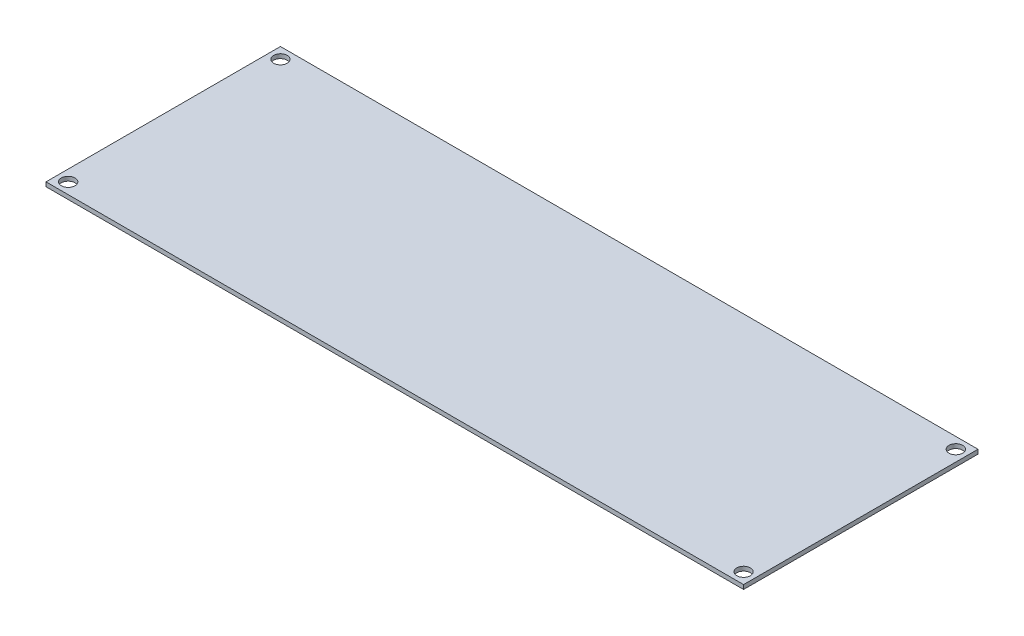
ISO-10303-21;
HEADER;
FILE_DESCRIPTION(('STEP AP214'),'2;1');
FILE_NAME('part.step','',(''),(''),'','','');
FILE_SCHEMA(('AUTOMOTIVE_DESIGN { 1 0 10303 214 1 1 1 1 }'));
ENDSEC;
DATA;
#1=APPLICATION_CONTEXT('core data for automotive mechanical design processes');
#2=APPLICATION_PROTOCOL_DEFINITION('international standard','automotive_design',2000,#1);
#3=PRODUCT_CONTEXT('',#1,'mechanical');
#4=PRODUCT('Part','Part','',(#3));
#5=PRODUCT_RELATED_PRODUCT_CATEGORY('part','',(#4));
#6=PRODUCT_DEFINITION_FORMATION('','',#4);
#7=PRODUCT_DEFINITION_CONTEXT('part definition',#1,'design');
#8=PRODUCT_DEFINITION('design','',#6,#7);
#9=PRODUCT_DEFINITION_SHAPE('','',#8);
#10=(LENGTH_UNIT() NAMED_UNIT(*) SI_UNIT(.MILLI.,.METRE.));
#11=(NAMED_UNIT(*) PLANE_ANGLE_UNIT() SI_UNIT($,.RADIAN.));
#12=(NAMED_UNIT(*) SI_UNIT($,.STERADIAN.) SOLID_ANGLE_UNIT());
#13=UNCERTAINTY_MEASURE_WITH_UNIT(LENGTH_MEASURE(1.E-05),#10,'distance_accuracy_value','');
#14=(GEOMETRIC_REPRESENTATION_CONTEXT(3) GLOBAL_UNCERTAINTY_ASSIGNED_CONTEXT((#13)) GLOBAL_UNIT_ASSIGNED_CONTEXT((#10,
#11,#12)) REPRESENTATION_CONTEXT('',''));
#15=CARTESIAN_POINT('',(0.,0.,0.));
#16=DIRECTION('',(0.,0.,1.));
#17=DIRECTION('',(1.,0.,0.));
#18=AXIS2_PLACEMENT_3D('',#15,#16,#17);
#19=CARTESIAN_POINT('',(0.,1.,0.));
#20=DIRECTION('',(0.,-1.,0.));
#21=DIRECTION('',(0.,0.,-1.));
#22=AXIS2_PLACEMENT_3D('',#19,#20,#21);
#23=PLANE('',#22);
#24=CARTESIAN_POINT('',(-79.23,1.,-24.9));
#25=DIRECTION('',(0.,1.,0.));
#26=DIRECTION('',(0.,0.,1.));
#27=AXIS2_PLACEMENT_3D('',#24,#25,#26);
#28=CIRCLE('',#27,1.6);
#29=CARTESIAN_POINT('',(-79.23,1.,-23.3));
#30=VERTEX_POINT('',#29);
#31=EDGE_CURVE('E120',#30,#30,#28,.T.);
#32=ORIENTED_EDGE('',*,*,#31,.F.);
#33=EDGE_LOOP('',(#32));
#34=FACE_BOUND('',#33,.T.);
#35=CARTESIAN_POINT('',(79.23,1.,-24.9));
#36=DIRECTION('',(0.,1.,0.));
#37=DIRECTION('',(0.,0.,1.));
#38=AXIS2_PLACEMENT_3D('',#35,#36,#37);
#39=CIRCLE('',#38,1.6);
#40=CARTESIAN_POINT('',(79.23,1.,-23.3));
#41=VERTEX_POINT('',#40);
#42=EDGE_CURVE('E99',#41,#41,#39,.T.);
#43=ORIENTED_EDGE('',*,*,#42,.F.);
#44=EDGE_LOOP('',(#43));
#45=FACE_BOUND('',#44,.T.);
#46=DIRECTION('',(0.,0.,-1.));
#47=VECTOR('',#46,1.);
#48=CARTESIAN_POINT('',(81.83,1.,27.5));
#49=LINE('',#48,#47);
#50=CARTESIAN_POINT('',(81.83,1.,27.5));
#51=VERTEX_POINT('',#50);
#52=CARTESIAN_POINT('',(81.83,1.,-27.5));
#53=VERTEX_POINT('',#52);
#54=EDGE_CURVE('E84',#51,#53,#49,.T.);
#55=ORIENTED_EDGE('',*,*,#54,.T.);
#56=DIRECTION('',(-1.,0.,0.));
#57=VECTOR('',#56,1.);
#58=CARTESIAN_POINT('',(-81.83,1.,-27.5));
#59=LINE('',#58,#57);
#60=CARTESIAN_POINT('',(-81.83,1.,-27.5));
#61=VERTEX_POINT('',#60);
#62=EDGE_CURVE('E79',#53,#61,#59,.T.);
#63=ORIENTED_EDGE('',*,*,#62,.T.);
#64=DIRECTION('',(0.,0.,1.));
#65=VECTOR('',#64,1.);
#66=CARTESIAN_POINT('',(-81.83,1.,27.5));
#67=LINE('',#66,#65);
#68=CARTESIAN_POINT('',(-81.83,1.,27.5));
#69=VERTEX_POINT('',#68);
#70=EDGE_CURVE('E82',#61,#69,#67,.T.);
#71=ORIENTED_EDGE('',*,*,#70,.T.);
#72=DIRECTION('',(1.,0.,0.));
#73=VECTOR('',#72,1.);
#74=CARTESIAN_POINT('',(-81.83,1.,27.5));
#75=LINE('',#74,#73);
#76=EDGE_CURVE('E49',#69,#51,#75,.T.);
#77=ORIENTED_EDGE('',*,*,#76,.T.);
#78=EDGE_LOOP('',(#55,#63,#71,#77));
#79=FACE_BOUND('',#78,.T.);
#80=CARTESIAN_POINT('',(79.23,1.,24.9));
#81=DIRECTION('',(0.,1.,0.));
#82=DIRECTION('',(0.,0.,1.));
#83=AXIS2_PLACEMENT_3D('',#80,#81,#82);
#84=CIRCLE('',#83,1.6);
#85=CARTESIAN_POINT('',(79.23,1.,26.5));
#86=VERTEX_POINT('',#85);
#87=EDGE_CURVE('E114',#86,#86,#84,.T.);
#88=ORIENTED_EDGE('',*,*,#87,.F.);
#89=EDGE_LOOP('',(#88));
#90=FACE_BOUND('',#89,.T.);
#91=CARTESIAN_POINT('',(-79.23,1.,24.9));
#92=DIRECTION('',(0.,1.,0.));
#93=DIRECTION('',(0.,0.,1.));
#94=AXIS2_PLACEMENT_3D('',#91,#92,#93);
#95=CIRCLE('',#94,1.6);
#96=CARTESIAN_POINT('',(-79.23,1.,26.5));
#97=VERTEX_POINT('',#96);
#98=EDGE_CURVE('E126',#97,#97,#95,.T.);
#99=ORIENTED_EDGE('',*,*,#98,.F.);
#100=EDGE_LOOP('',(#99));
#101=FACE_BOUND('',#100,.T.);
#102=ADVANCED_FACE('F32',(#34,#45,#79,#90,#101),#23,.F.);
#103=CARTESIAN_POINT('',(0.,0.,0.));
#104=DIRECTION('',(0.,-1.,0.));
#105=DIRECTION('',(0.,0.,-1.));
#106=AXIS2_PLACEMENT_3D('',#103,#104,#105);
#107=PLANE('',#106);
#108=CARTESIAN_POINT('',(-79.23,0.,-24.9));
#109=DIRECTION('',(0.,1.,0.));
#110=DIRECTION('',(0.,0.,1.));
#111=AXIS2_PLACEMENT_3D('',#108,#109,#110);
#112=CIRCLE('',#111,1.6);
#113=CARTESIAN_POINT('',(-79.23,0.,-23.3));
#114=VERTEX_POINT('',#113);
#115=EDGE_CURVE('E123',#114,#114,#112,.T.);
#116=ORIENTED_EDGE('',*,*,#115,.T.);
#117=EDGE_LOOP('',(#116));
#118=FACE_BOUND('',#117,.T.);
#119=CARTESIAN_POINT('',(79.23,0.,-24.9));
#120=DIRECTION('',(0.,1.,0.));
#121=DIRECTION('',(0.,0.,1.));
#122=AXIS2_PLACEMENT_3D('',#119,#120,#121);
#123=CIRCLE('',#122,1.6);
#124=CARTESIAN_POINT('',(79.23,0.,-23.3));
#125=VERTEX_POINT('',#124);
#126=EDGE_CURVE('E111',#125,#125,#123,.T.);
#127=ORIENTED_EDGE('',*,*,#126,.T.);
#128=EDGE_LOOP('',(#127));
#129=FACE_BOUND('',#128,.T.);
#130=DIRECTION('',(0.,0.,-1.));
#131=VECTOR('',#130,1.);
#132=CARTESIAN_POINT('',(81.83,0.,27.5));
#133=LINE('',#132,#131);
#134=CARTESIAN_POINT('',(81.83,0.,27.5));
#135=VERTEX_POINT('',#134);
#136=CARTESIAN_POINT('',(81.83,0.,-27.5));
#137=VERTEX_POINT('',#136);
#138=EDGE_CURVE('E96',#135,#137,#133,.T.);
#139=ORIENTED_EDGE('',*,*,#138,.F.);
#140=DIRECTION('',(1.,0.,0.));
#141=VECTOR('',#140,1.);
#142=CARTESIAN_POINT('',(-81.83,0.,27.5));
#143=LINE('',#142,#141);
#144=CARTESIAN_POINT('',(-81.83,0.,27.5));
#145=VERTEX_POINT('',#144);
#146=EDGE_CURVE('E72',#145,#135,#143,.T.);
#147=ORIENTED_EDGE('',*,*,#146,.F.);
#148=DIRECTION('',(0.,0.,1.));
#149=VECTOR('',#148,1.);
#150=CARTESIAN_POINT('',(-81.83,0.,27.5));
#151=LINE('',#150,#149);
#152=CARTESIAN_POINT('',(-81.83,0.,-27.5));
#153=VERTEX_POINT('',#152);
#154=EDGE_CURVE('E66',#153,#145,#151,.T.);
#155=ORIENTED_EDGE('',*,*,#154,.F.);
#156=DIRECTION('',(-1.,0.,0.));
#157=VECTOR('',#156,1.);
#158=CARTESIAN_POINT('',(-81.83,0.,-27.5));
#159=LINE('',#158,#157);
#160=EDGE_CURVE('E88',#137,#153,#159,.T.);
#161=ORIENTED_EDGE('',*,*,#160,.F.);
#162=EDGE_LOOP('',(#139,#147,#155,#161));
#163=FACE_BOUND('',#162,.T.);
#164=CARTESIAN_POINT('',(79.23,0.,24.9));
#165=DIRECTION('',(0.,1.,0.));
#166=DIRECTION('',(0.,0.,1.));
#167=AXIS2_PLACEMENT_3D('',#164,#165,#166);
#168=CIRCLE('',#167,1.6);
#169=CARTESIAN_POINT('',(79.23,0.,26.5));
#170=VERTEX_POINT('',#169);
#171=EDGE_CURVE('E117',#170,#170,#168,.T.);
#172=ORIENTED_EDGE('',*,*,#171,.T.);
#173=EDGE_LOOP('',(#172));
#174=FACE_BOUND('',#173,.T.);
#175=CARTESIAN_POINT('',(-79.23,0.,24.9));
#176=DIRECTION('',(0.,1.,0.));
#177=DIRECTION('',(0.,0.,1.));
#178=AXIS2_PLACEMENT_3D('',#175,#176,#177);
#179=CIRCLE('',#178,1.6);
#180=CARTESIAN_POINT('',(-79.23,0.,26.5));
#181=VERTEX_POINT('',#180);
#182=EDGE_CURVE('E129',#181,#181,#179,.T.);
#183=ORIENTED_EDGE('',*,*,#182,.T.);
#184=EDGE_LOOP('',(#183));
#185=FACE_BOUND('',#184,.T.);
#186=ADVANCED_FACE('F107',(#118,#129,#163,#174,#185),#107,.T.);
#187=CARTESIAN_POINT('',(81.83,1.,27.5));
#188=DIRECTION('',(-1.,0.,0.));
#189=DIRECTION('',(0.,0.,1.));
#190=AXIS2_PLACEMENT_3D('',#187,#188,#189);
#191=PLANE('',#190);
#192=ORIENTED_EDGE('',*,*,#138,.T.);
#193=DIRECTION('',(0.,-1.,0.));
#194=VECTOR('',#193,1.);
#195=CARTESIAN_POINT('',(81.83,1.,-27.5));
#196=LINE('',#195,#194);
#197=EDGE_CURVE('E11',#53,#137,#196,.T.);
#198=ORIENTED_EDGE('',*,*,#197,.F.);
#199=ORIENTED_EDGE('',*,*,#54,.F.);
#200=DIRECTION('',(0.,-1.,0.));
#201=VECTOR('',#200,1.);
#202=CARTESIAN_POINT('',(81.83,1.,27.5));
#203=LINE('',#202,#201);
#204=EDGE_CURVE('E92',#51,#135,#203,.T.);
#205=ORIENTED_EDGE('',*,*,#204,.T.);
#206=EDGE_LOOP('',(#192,#198,#199,#205));
#207=FACE_BOUND('',#206,.T.);
#208=ADVANCED_FACE('F34',(#207),#191,.F.);
#209=CARTESIAN_POINT('',(-81.83,1.,-27.5));
#210=DIRECTION('',(0.,0.,1.));
#211=DIRECTION('',(1.,0.,0.));
#212=AXIS2_PLACEMENT_3D('',#209,#210,#211);
#213=PLANE('',#212);
#214=ORIENTED_EDGE('',*,*,#160,.T.);
#215=DIRECTION('',(0.,-1.,0.));
#216=VECTOR('',#215,1.);
#217=CARTESIAN_POINT('',(-81.83,1.,-27.5));
#218=LINE('',#217,#216);
#219=EDGE_CURVE('E41',#61,#153,#218,.T.);
#220=ORIENTED_EDGE('',*,*,#219,.F.);
#221=ORIENTED_EDGE('',*,*,#62,.F.);
#222=ORIENTED_EDGE('',*,*,#197,.T.);
#223=EDGE_LOOP('',(#214,#220,#221,#222));
#224=FACE_BOUND('',#223,.T.);
#225=ADVANCED_FACE('F87',(#224),#213,.F.);
#226=CARTESIAN_POINT('',(-81.83,1.,27.5));
#227=DIRECTION('',(1.,0.,0.));
#228=DIRECTION('',(0.,0.,-1.));
#229=AXIS2_PLACEMENT_3D('',#226,#227,#228);
#230=PLANE('',#229);
#231=ORIENTED_EDGE('',*,*,#154,.T.);
#232=DIRECTION('',(0.,-1.,0.));
#233=VECTOR('',#232,1.);
#234=CARTESIAN_POINT('',(-81.83,1.,27.5));
#235=LINE('',#234,#233);
#236=EDGE_CURVE('E89',#69,#145,#235,.T.);
#237=ORIENTED_EDGE('',*,*,#236,.F.);
#238=ORIENTED_EDGE('',*,*,#70,.F.);
#239=ORIENTED_EDGE('',*,*,#219,.T.);
#240=EDGE_LOOP('',(#231,#237,#238,#239));
#241=FACE_BOUND('',#240,.T.);
#242=ADVANCED_FACE('F90',(#241),#230,.F.);
#243=CARTESIAN_POINT('',(-81.83,1.,27.5));
#244=DIRECTION('',(0.,0.,-1.));
#245=DIRECTION('',(-1.,0.,0.));
#246=AXIS2_PLACEMENT_3D('',#243,#244,#245);
#247=PLANE('',#246);
#248=ORIENTED_EDGE('',*,*,#146,.T.);
#249=ORIENTED_EDGE('',*,*,#204,.F.);
#250=ORIENTED_EDGE('',*,*,#76,.F.);
#251=ORIENTED_EDGE('',*,*,#236,.T.);
#252=EDGE_LOOP('',(#248,#249,#250,#251));
#253=FACE_BOUND('',#252,.T.);
#254=ADVANCED_FACE('F104',(#253),#247,.F.);
#255=CARTESIAN_POINT('',(79.23,1.,-24.9));
#256=DIRECTION('',(0.,-1.,0.));
#257=DIRECTION('',(0.,0.,-1.));
#258=AXIS2_PLACEMENT_3D('',#255,#256,#257);
#259=CYLINDRICAL_SURFACE('',#258,1.6);
#260=ORIENTED_EDGE('',*,*,#42,.T.);
#261=EDGE_LOOP('',(#260));
#262=FACE_BOUND('',#261,.T.);
#263=ORIENTED_EDGE('',*,*,#126,.F.);
#264=EDGE_LOOP('',(#263));
#265=FACE_BOUND('',#264,.T.);
#266=ADVANCED_FACE('F149',(#262,#265),#259,.F.);
#267=CARTESIAN_POINT('',(79.23,1.,24.9));
#268=DIRECTION('',(0.,-1.,0.));
#269=DIRECTION('',(0.,0.,-1.));
#270=AXIS2_PLACEMENT_3D('',#267,#268,#269);
#271=CYLINDRICAL_SURFACE('',#270,1.6);
#272=ORIENTED_EDGE('',*,*,#87,.T.);
#273=EDGE_LOOP('',(#272));
#274=FACE_BOUND('',#273,.T.);
#275=ORIENTED_EDGE('',*,*,#171,.F.);
#276=EDGE_LOOP('',(#275));
#277=FACE_BOUND('',#276,.T.);
#278=ADVANCED_FACE('F195',(#274,#277),#271,.F.);
#279=CARTESIAN_POINT('',(-79.23,1.,-24.9));
#280=DIRECTION('',(0.,-1.,0.));
#281=DIRECTION('',(0.,0.,-1.));
#282=AXIS2_PLACEMENT_3D('',#279,#280,#281);
#283=CYLINDRICAL_SURFACE('',#282,1.6);
#284=ORIENTED_EDGE('',*,*,#31,.T.);
#285=EDGE_LOOP('',(#284));
#286=FACE_BOUND('',#285,.T.);
#287=ORIENTED_EDGE('',*,*,#115,.F.);
#288=EDGE_LOOP('',(#287));
#289=FACE_BOUND('',#288,.T.);
#290=ADVANCED_FACE('F203',(#286,#289),#283,.F.);
#291=CARTESIAN_POINT('',(-79.23,1.,24.9));
#292=DIRECTION('',(0.,-1.,0.));
#293=DIRECTION('',(0.,0.,-1.));
#294=AXIS2_PLACEMENT_3D('',#291,#292,#293);
#295=CYLINDRICAL_SURFACE('',#294,1.6);
#296=ORIENTED_EDGE('',*,*,#98,.T.);
#297=EDGE_LOOP('',(#296));
#298=FACE_BOUND('',#297,.T.);
#299=ORIENTED_EDGE('',*,*,#182,.F.);
#300=EDGE_LOOP('',(#299));
#301=FACE_BOUND('',#300,.T.);
#302=ADVANCED_FACE('F135',(#298,#301),#295,.F.);
#303=CLOSED_SHELL('',(#102,#186,#208,#225,#242,#254,#266,#278,#290,#302));
#304=MANIFOLD_SOLID_BREP('B2',#303);
#305=ADVANCED_BREP_SHAPE_REPRESENTATION('',(#18,#304),#14);
#306=SHAPE_DEFINITION_REPRESENTATION(#9,#305);
ENDSEC;
END-ISO-10303-21;
